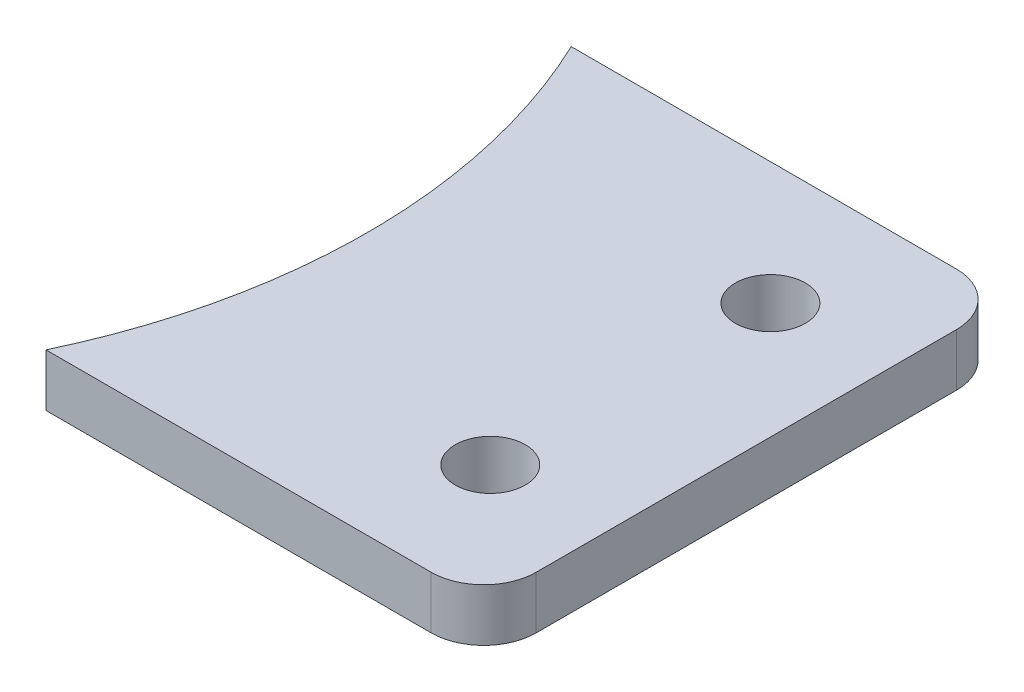
ISO-10303-21;
HEADER;
FILE_DESCRIPTION(('STEP AP214'),'2;1');
FILE_NAME('part.step','',(''),(''),'','','');
FILE_SCHEMA(('AUTOMOTIVE_DESIGN { 1 0 10303 214 1 1 1 1 }'));
ENDSEC;
DATA;
#1=APPLICATION_CONTEXT('core data for automotive mechanical design processes');
#2=APPLICATION_PROTOCOL_DEFINITION('international standard','automotive_design',2000,#1);
#3=PRODUCT_CONTEXT('',#1,'mechanical');
#4=PRODUCT('Part','Part','',(#3));
#5=PRODUCT_RELATED_PRODUCT_CATEGORY('part','',(#4));
#6=PRODUCT_DEFINITION_FORMATION('','',#4);
#7=PRODUCT_DEFINITION_CONTEXT('part definition',#1,'design');
#8=PRODUCT_DEFINITION('design','',#6,#7);
#9=PRODUCT_DEFINITION_SHAPE('','',#8);
#10=(LENGTH_UNIT() NAMED_UNIT(*) SI_UNIT(.MILLI.,.METRE.));
#11=(NAMED_UNIT(*) PLANE_ANGLE_UNIT() SI_UNIT($,.RADIAN.));
#12=(NAMED_UNIT(*) SI_UNIT($,.STERADIAN.) SOLID_ANGLE_UNIT());
#13=UNCERTAINTY_MEASURE_WITH_UNIT(LENGTH_MEASURE(1.E-05),#10,'distance_accuracy_value','');
#14=(GEOMETRIC_REPRESENTATION_CONTEXT(3) GLOBAL_UNCERTAINTY_ASSIGNED_CONTEXT((#13)) GLOBAL_UNIT_ASSIGNED_CONTEXT((#10,
#11,#12)) REPRESENTATION_CONTEXT('',''));
#15=CARTESIAN_POINT('',(0.,0.,0.));
#16=DIRECTION('',(0.,0.,1.));
#17=DIRECTION('',(1.,0.,0.));
#18=AXIS2_PLACEMENT_3D('',#15,#16,#17);
#19=CARTESIAN_POINT('',(0.,3.,0.));
#20=DIRECTION('',(0.,1.,0.));
#21=DIRECTION('',(0.,0.,1.));
#22=AXIS2_PLACEMENT_3D('',#19,#20,#21);
#23=PLANE('',#22);
#24=CARTESIAN_POINT('',(50.,3.,-8.));
#25=DIRECTION('',(0.,1.,0.));
#26=DIRECTION('',(0.,0.,1.));
#27=AXIS2_PLACEMENT_3D('',#24,#25,#26);
#28=CIRCLE('',#27,2.);
#29=CARTESIAN_POINT('',(50.,3.,-6.));
#30=VERTEX_POINT('',#29);
#31=EDGE_CURVE('E164',#30,#30,#28,.T.);
#32=ORIENTED_EDGE('',*,*,#31,.F.);
#33=EDGE_LOOP('',(#32));
#34=FACE_BOUND('',#33,.T.);
#35=DIRECTION('',(1.,0.,0.));
#36=VECTOR('',#35,1.);
#37=CARTESIAN_POINT('',(31.6227766016838,3.,15.));
#38=LINE('',#37,#36);
#39=CARTESIAN_POINT('',(31.6227766016838,3.,15.));
#40=VERTEX_POINT('',#39);
#41=CARTESIAN_POINT('',(53.6227766016838,3.,15.));
#42=VERTEX_POINT('',#41);
#43=EDGE_CURVE('E96',#40,#42,#38,.T.);
#44=ORIENTED_EDGE('',*,*,#43,.T.);
#45=CARTESIAN_POINT('',(53.6227766016838,3.,12.));
#46=DIRECTION('',(0.,1.,0.));
#47=DIRECTION('',(0.,0.,1.));
#48=AXIS2_PLACEMENT_3D('',#45,#46,#47);
#49=CIRCLE('',#48,3.);
#50=CARTESIAN_POINT('',(56.6227766016838,3.,12.));
#51=VERTEX_POINT('',#50);
#52=EDGE_CURVE('E51',#42,#51,#49,.T.);
#53=ORIENTED_EDGE('',*,*,#52,.T.);
#54=DIRECTION('',(0.,0.,-1.));
#55=VECTOR('',#54,1.);
#56=CARTESIAN_POINT('',(56.6227766016838,3.,-15.));
#57=LINE('',#56,#55);
#58=CARTESIAN_POINT('',(56.6227766016838,3.,-12.));
#59=VERTEX_POINT('',#58);
#60=EDGE_CURVE('E104',#51,#59,#57,.T.);
#61=ORIENTED_EDGE('',*,*,#60,.T.);
#62=CARTESIAN_POINT('',(53.6227766016838,3.,-12.));
#63=DIRECTION('',(0.,1.,0.));
#64=DIRECTION('',(0.,0.,1.));
#65=AXIS2_PLACEMENT_3D('',#62,#63,#64);
#66=CIRCLE('',#65,3.);
#67=CARTESIAN_POINT('',(53.6227766016838,3.,-15.));
#68=VERTEX_POINT('',#67);
#69=EDGE_CURVE('E58',#59,#68,#66,.T.);
#70=ORIENTED_EDGE('',*,*,#69,.T.);
#71=DIRECTION('',(-1.,0.,0.));
#72=VECTOR('',#71,1.);
#73=CARTESIAN_POINT('',(31.6227766016838,3.,-15.));
#74=LINE('',#73,#72);
#75=CARTESIAN_POINT('',(31.6227766016838,3.,-15.));
#76=VERTEX_POINT('',#75);
#77=EDGE_CURVE('E109',#68,#76,#74,.T.);
#78=ORIENTED_EDGE('',*,*,#77,.T.);
#79=CARTESIAN_POINT('',(0.,3.,0.));
#80=DIRECTION('',(0.,-1.,0.));
#81=DIRECTION('',(0.,0.,1.));
#82=AXIS2_PLACEMENT_3D('',#79,#80,#81);
#83=CIRCLE('',#82,35.);
#84=EDGE_CURVE('E105',#76,#40,#83,.T.);
#85=ORIENTED_EDGE('',*,*,#84,.T.);
#86=EDGE_LOOP('',(#44,#53,#61,#70,#78,#85));
#87=FACE_BOUND('',#86,.T.);
#88=CARTESIAN_POINT('',(50.,3.,8.));
#89=DIRECTION('',(0.,1.,0.));
#90=DIRECTION('',(0.,0.,-1.));
#91=AXIS2_PLACEMENT_3D('',#88,#89,#90);
#92=CIRCLE('',#91,2.);
#93=CARTESIAN_POINT('',(50.,3.,6.));
#94=VERTEX_POINT('',#93);
#95=EDGE_CURVE('E280',#94,#94,#92,.T.);
#96=ORIENTED_EDGE('',*,*,#95,.F.);
#97=EDGE_LOOP('',(#96));
#98=FACE_BOUND('',#97,.T.);
#99=ADVANCED_FACE('F42',(#34,#87,#98),#23,.T.);
#100=CARTESIAN_POINT('',(0.,0.,0.));
#101=DIRECTION('',(0.,1.,0.));
#102=DIRECTION('',(0.,0.,1.));
#103=AXIS2_PLACEMENT_3D('',#100,#101,#102);
#104=PLANE('',#103);
#105=DIRECTION('',(0.,0.,-1.));
#106=VECTOR('',#105,1.);
#107=CARTESIAN_POINT('',(56.6227766016838,0.,-15.));
#108=LINE('',#107,#106);
#109=CARTESIAN_POINT('',(56.6227766016838,0.,12.));
#110=VERTEX_POINT('',#109);
#111=CARTESIAN_POINT('',(56.6227766016838,0.,-12.));
#112=VERTEX_POINT('',#111);
#113=EDGE_CURVE('E158',#110,#112,#108,.T.);
#114=ORIENTED_EDGE('',*,*,#113,.F.);
#115=CARTESIAN_POINT('',(53.6227766016838,0.,12.));
#116=DIRECTION('',(0.,1.,0.));
#117=DIRECTION('',(0.,0.,1.));
#118=AXIS2_PLACEMENT_3D('',#115,#116,#117);
#119=CIRCLE('',#118,3.);
#120=CARTESIAN_POINT('',(53.6227766016838,0.,15.));
#121=VERTEX_POINT('',#120);
#122=EDGE_CURVE('E136',#110,#121,#119,.F.);
#123=ORIENTED_EDGE('',*,*,#122,.T.);
#124=DIRECTION('',(1.,0.,0.));
#125=VECTOR('',#124,1.);
#126=CARTESIAN_POINT('',(31.6227766016838,0.,15.));
#127=LINE('',#126,#125);
#128=CARTESIAN_POINT('',(31.6227766016838,0.,15.));
#129=VERTEX_POINT('',#128);
#130=EDGE_CURVE('E157',#129,#121,#127,.T.);
#131=ORIENTED_EDGE('',*,*,#130,.F.);
#132=CARTESIAN_POINT('',(0.,0.,0.));
#133=DIRECTION('',(0.,-1.,0.));
#134=DIRECTION('',(0.,0.,1.));
#135=AXIS2_PLACEMENT_3D('',#132,#133,#134);
#136=CIRCLE('',#135,35.);
#137=CARTESIAN_POINT('',(31.6227766016838,0.,-15.));
#138=VERTEX_POINT('',#137);
#139=EDGE_CURVE('E118',#138,#129,#136,.T.);
#140=ORIENTED_EDGE('',*,*,#139,.F.);
#141=DIRECTION('',(-1.,0.,0.));
#142=VECTOR('',#141,1.);
#143=CARTESIAN_POINT('',(31.6227766016838,0.,-15.));
#144=LINE('',#143,#142);
#145=CARTESIAN_POINT('',(53.6227766016838,0.,-15.));
#146=VERTEX_POINT('',#145);
#147=EDGE_CURVE('E114',#146,#138,#144,.T.);
#148=ORIENTED_EDGE('',*,*,#147,.F.);
#149=CARTESIAN_POINT('',(53.6227766016838,0.,-12.));
#150=DIRECTION('',(0.,1.,0.));
#151=DIRECTION('',(0.,0.,1.));
#152=AXIS2_PLACEMENT_3D('',#149,#150,#151);
#153=CIRCLE('',#152,3.);
#154=EDGE_CURVE('E133',#146,#112,#153,.F.);
#155=ORIENTED_EDGE('',*,*,#154,.T.);
#156=EDGE_LOOP('',(#114,#123,#131,#140,#148,#155));
#157=FACE_BOUND('',#156,.T.);
#158=CARTESIAN_POINT('',(50.,0.,-8.));
#159=DIRECTION('',(0.,1.,0.));
#160=DIRECTION('',(0.,0.,1.));
#161=AXIS2_PLACEMENT_3D('',#158,#159,#160);
#162=CIRCLE('',#161,2.);
#163=CARTESIAN_POINT('',(50.,0.,-6.));
#164=VERTEX_POINT('',#163);
#165=EDGE_CURVE('E288',#164,#164,#162,.T.);
#166=ORIENTED_EDGE('',*,*,#165,.T.);
#167=EDGE_LOOP('',(#166));
#168=FACE_BOUND('',#167,.T.);
#169=CARTESIAN_POINT('',(50.,0.,8.));
#170=DIRECTION('',(0.,1.,0.));
#171=DIRECTION('',(0.,0.,-1.));
#172=AXIS2_PLACEMENT_3D('',#169,#170,#171);
#173=CIRCLE('',#172,2.);
#174=CARTESIAN_POINT('',(50.,0.,6.));
#175=VERTEX_POINT('',#174);
#176=EDGE_CURVE('E283',#175,#175,#173,.T.);
#177=ORIENTED_EDGE('',*,*,#176,.T.);
#178=EDGE_LOOP('',(#177));
#179=FACE_BOUND('',#178,.T.);
#180=ADVANCED_FACE('F155',(#157,#168,#179),#104,.F.);
#181=CARTESIAN_POINT('',(0.,3.,0.));
#182=DIRECTION('',(0.,-1.,0.));
#183=DIRECTION('',(0.,0.,-1.));
#184=AXIS2_PLACEMENT_3D('',#181,#182,#183);
#185=CYLINDRICAL_SURFACE('',#184,35.);
#186=ORIENTED_EDGE('',*,*,#139,.T.);
#187=DIRECTION('',(0.,-1.,0.));
#188=VECTOR('',#187,1.);
#189=CARTESIAN_POINT('',(31.6227766016838,3.,15.));
#190=LINE('',#189,#188);
#191=EDGE_CURVE('E100',#40,#129,#190,.T.);
#192=ORIENTED_EDGE('',*,*,#191,.F.);
#193=ORIENTED_EDGE('',*,*,#84,.F.);
#194=DIRECTION('',(0.,-1.,0.));
#195=VECTOR('',#194,1.);
#196=CARTESIAN_POINT('',(31.6227766016838,3.,-15.));
#197=LINE('',#196,#195);
#198=EDGE_CURVE('E121',#76,#138,#197,.T.);
#199=ORIENTED_EDGE('',*,*,#198,.T.);
#200=EDGE_LOOP('',(#186,#192,#193,#199));
#201=FACE_BOUND('',#200,.T.);
#202=ADVANCED_FACE('F116',(#201),#185,.F.);
#203=CARTESIAN_POINT('',(31.6227766016838,3.,15.));
#204=DIRECTION('',(0.,0.,-1.));
#205=DIRECTION('',(-1.,0.,0.));
#206=AXIS2_PLACEMENT_3D('',#203,#204,#205);
#207=PLANE('',#206);
#208=ORIENTED_EDGE('',*,*,#130,.T.);
#209=DIRECTION('',(0.,-1.,0.));
#210=VECTOR('',#209,1.);
#211=CARTESIAN_POINT('',(53.6227766016838,3.,15.));
#212=LINE('',#211,#210);
#213=EDGE_CURVE('E66',#121,#42,#212,.F.);
#214=ORIENTED_EDGE('',*,*,#213,.T.);
#215=ORIENTED_EDGE('',*,*,#43,.F.);
#216=ORIENTED_EDGE('',*,*,#191,.T.);
#217=EDGE_LOOP('',(#208,#214,#215,#216));
#218=FACE_BOUND('',#217,.T.);
#219=ADVANCED_FACE('F98',(#218),#207,.F.);
#220=CARTESIAN_POINT('',(56.6227766016838,3.,-15.));
#221=DIRECTION('',(-1.,0.,0.));
#222=DIRECTION('',(0.,0.,1.));
#223=AXIS2_PLACEMENT_3D('',#220,#221,#222);
#224=PLANE('',#223);
#225=ORIENTED_EDGE('',*,*,#60,.F.);
#226=DIRECTION('',(0.,-1.,0.));
#227=VECTOR('',#226,1.);
#228=CARTESIAN_POINT('',(56.6227766016838,3.,12.));
#229=LINE('',#228,#227);
#230=EDGE_CURVE('E125',#51,#110,#229,.T.);
#231=ORIENTED_EDGE('',*,*,#230,.T.);
#232=ORIENTED_EDGE('',*,*,#113,.T.);
#233=DIRECTION('',(0.,-1.,0.));
#234=VECTOR('',#233,1.);
#235=CARTESIAN_POINT('',(56.6227766016838,3.,-12.));
#236=LINE('',#235,#234);
#237=EDGE_CURVE('E120',#112,#59,#236,.F.);
#238=ORIENTED_EDGE('',*,*,#237,.T.);
#239=EDGE_LOOP('',(#225,#231,#232,#238));
#240=FACE_BOUND('',#239,.T.);
#241=ADVANCED_FACE('F147',(#240),#224,.F.);
#242=CARTESIAN_POINT('',(31.6227766016838,3.,-15.));
#243=DIRECTION('',(0.,0.,1.));
#244=DIRECTION('',(1.,0.,0.));
#245=AXIS2_PLACEMENT_3D('',#242,#243,#244);
#246=PLANE('',#245);
#247=ORIENTED_EDGE('',*,*,#77,.F.);
#248=DIRECTION('',(0.,-1.,0.));
#249=VECTOR('',#248,1.);
#250=CARTESIAN_POINT('',(53.6227766016838,3.,-15.));
#251=LINE('',#250,#249);
#252=EDGE_CURVE('E11',#68,#146,#251,.T.);
#253=ORIENTED_EDGE('',*,*,#252,.T.);
#254=ORIENTED_EDGE('',*,*,#147,.T.);
#255=ORIENTED_EDGE('',*,*,#198,.F.);
#256=EDGE_LOOP('',(#247,#253,#254,#255));
#257=FACE_BOUND('',#256,.T.);
#258=ADVANCED_FACE('F170',(#257),#246,.F.);
#259=CARTESIAN_POINT('',(50.,3.,-8.));
#260=DIRECTION('',(0.,-1.,0.));
#261=DIRECTION('',(0.,0.,-1.));
#262=AXIS2_PLACEMENT_3D('',#259,#260,#261);
#263=CYLINDRICAL_SURFACE('',#262,2.);
#264=ORIENTED_EDGE('',*,*,#31,.T.);
#265=EDGE_LOOP('',(#264));
#266=FACE_BOUND('',#265,.T.);
#267=ORIENTED_EDGE('',*,*,#165,.F.);
#268=EDGE_LOOP('',(#267));
#269=FACE_BOUND('',#268,.T.);
#270=ADVANCED_FACE('F187',(#266,#269),#263,.F.);
#271=CARTESIAN_POINT('',(50.,3.,8.));
#272=DIRECTION('',(0.,-1.,0.));
#273=DIRECTION('',(0.,0.,-1.));
#274=AXIS2_PLACEMENT_3D('',#271,#272,#273);
#275=CYLINDRICAL_SURFACE('',#274,2.);
#276=ORIENTED_EDGE('',*,*,#95,.T.);
#277=EDGE_LOOP('',(#276));
#278=FACE_BOUND('',#277,.T.);
#279=ORIENTED_EDGE('',*,*,#176,.F.);
#280=EDGE_LOOP('',(#279));
#281=FACE_BOUND('',#280,.T.);
#282=ADVANCED_FACE('F177',(#278,#281),#275,.F.);
#283=CARTESIAN_POINT('',(53.6227766016838,3.,12.));
#284=DIRECTION('',(0.,-1.,0.));
#285=DIRECTION('',(0.,0.,-1.));
#286=AXIS2_PLACEMENT_3D('',#283,#284,#285);
#287=CYLINDRICAL_SURFACE('',#286,3.);
#288=ORIENTED_EDGE('',*,*,#52,.F.);
#289=ORIENTED_EDGE('',*,*,#213,.F.);
#290=ORIENTED_EDGE('',*,*,#122,.F.);
#291=ORIENTED_EDGE('',*,*,#230,.F.);
#292=EDGE_LOOP('',(#288,#289,#290,#291));
#293=FACE_BOUND('',#292,.T.);
#294=ADVANCED_FACE('F153',(#293),#287,.T.);
#295=CARTESIAN_POINT('',(53.6227766016838,3.,-12.));
#296=DIRECTION('',(0.,-1.,0.));
#297=DIRECTION('',(0.,0.,-1.));
#298=AXIS2_PLACEMENT_3D('',#295,#296,#297);
#299=CYLINDRICAL_SURFACE('',#298,3.);
#300=ORIENTED_EDGE('',*,*,#69,.F.);
#301=ORIENTED_EDGE('',*,*,#237,.F.);
#302=ORIENTED_EDGE('',*,*,#154,.F.);
#303=ORIENTED_EDGE('',*,*,#252,.F.);
#304=EDGE_LOOP('',(#300,#301,#302,#303));
#305=FACE_BOUND('',#304,.T.);
#306=ADVANCED_FACE('F44',(#305),#299,.T.);
#307=CLOSED_SHELL('',(#99,#180,#202,#219,#241,#258,#270,#282,#294,#306));
#308=MANIFOLD_SOLID_BREP('B2',#307);
#309=ADVANCED_BREP_SHAPE_REPRESENTATION('',(#18,#308),#14);
#310=SHAPE_DEFINITION_REPRESENTATION(#9,#309);
ENDSEC;
END-ISO-10303-21;
